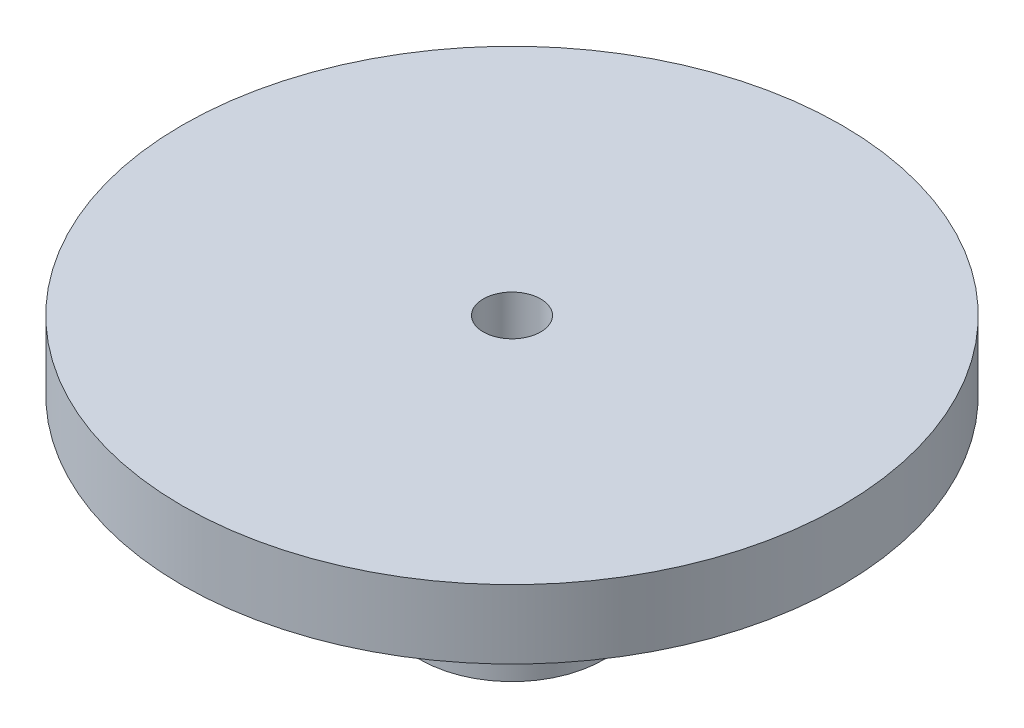
ISO-10303-21;
HEADER;
FILE_DESCRIPTION(('STEP AP214'),'2;1');
FILE_NAME('part.step','',(''),(''),'','','');
FILE_SCHEMA(('AUTOMOTIVE_DESIGN { 1 0 10303 214 1 1 1 1 }'));
ENDSEC;
DATA;
#1=APPLICATION_CONTEXT('core data for automotive mechanical design processes');
#2=APPLICATION_PROTOCOL_DEFINITION('international standard','automotive_design',2000,#1);
#3=PRODUCT_CONTEXT('',#1,'mechanical');
#4=PRODUCT('Part','Part','',(#3));
#5=PRODUCT_RELATED_PRODUCT_CATEGORY('part','',(#4));
#6=PRODUCT_DEFINITION_FORMATION('','',#4);
#7=PRODUCT_DEFINITION_CONTEXT('part definition',#1,'design');
#8=PRODUCT_DEFINITION('design','',#6,#7);
#9=PRODUCT_DEFINITION_SHAPE('','',#8);
#10=(LENGTH_UNIT() NAMED_UNIT(*) SI_UNIT(.MILLI.,.METRE.));
#11=(NAMED_UNIT(*) PLANE_ANGLE_UNIT() SI_UNIT($,.RADIAN.));
#12=(NAMED_UNIT(*) SI_UNIT($,.STERADIAN.) SOLID_ANGLE_UNIT());
#13=UNCERTAINTY_MEASURE_WITH_UNIT(LENGTH_MEASURE(1.E-05),#10,'distance_accuracy_value','');
#14=(GEOMETRIC_REPRESENTATION_CONTEXT(3) GLOBAL_UNCERTAINTY_ASSIGNED_CONTEXT((#13)) GLOBAL_UNIT_ASSIGNED_CONTEXT((#10,
#11,#12)) REPRESENTATION_CONTEXT('',''));
#15=CARTESIAN_POINT('',(0.,0.,0.));
#16=DIRECTION('',(0.,0.,1.));
#17=DIRECTION('',(1.,0.,0.));
#18=AXIS2_PLACEMENT_3D('',#15,#16,#17);
#19=CARTESIAN_POINT('',(0.,0.,0.));
#20=DIRECTION('',(0.,1.,0.));
#21=DIRECTION('',(0.,0.,1.));
#22=AXIS2_PLACEMENT_3D('',#19,#20,#21);
#23=PLANE('',#22);
#24=CARTESIAN_POINT('',(0.,0.,0.));
#25=DIRECTION('',(0.,1.,0.));
#26=DIRECTION('',(0.,0.,1.));
#27=AXIS2_PLACEMENT_3D('',#24,#25,#26);
#28=CIRCLE('',#27,8.);
#29=CARTESIAN_POINT('',(0.,0.,8.));
#30=VERTEX_POINT('',#29);
#31=EDGE_CURVE('E45',#30,#30,#28,.T.);
#32=ORIENTED_EDGE('',*,*,#31,.F.);
#33=EDGE_LOOP('',(#32));
#34=FACE_BOUND('',#33,.T.);
#35=CARTESIAN_POINT('',(0.,0.,0.));
#36=DIRECTION('',(0.,1.,0.));
#37=DIRECTION('',(0.,0.,1.));
#38=AXIS2_PLACEMENT_3D('',#35,#36,#37);
#39=CIRCLE('',#38,2.5);
#40=CARTESIAN_POINT('',(0.,0.,2.5));
#41=VERTEX_POINT('',#40);
#42=EDGE_CURVE('E54',#41,#41,#39,.T.);
#43=ORIENTED_EDGE('',*,*,#42,.T.);
#44=EDGE_LOOP('',(#43));
#45=FACE_BOUND('',#44,.T.);
#46=ADVANCED_FACE('F41',(#34,#45),#23,.F.);
#47=CARTESIAN_POINT('',(0.,16.,0.));
#48=DIRECTION('',(0.,-1.,0.));
#49=DIRECTION('',(0.,0.,-1.));
#50=AXIS2_PLACEMENT_3D('',#47,#48,#49);
#51=CYLINDRICAL_SURFACE('',#50,8.);
#52=CARTESIAN_POINT('',(0.,16.,0.));
#53=DIRECTION('',(0.,1.,0.));
#54=DIRECTION('',(0.,0.,1.));
#55=AXIS2_PLACEMENT_3D('',#52,#53,#54);
#56=CIRCLE('',#55,8.);
#57=CARTESIAN_POINT('',(0.,16.,8.));
#58=VERTEX_POINT('',#57);
#59=EDGE_CURVE('E10',#58,#58,#56,.T.);
#60=ORIENTED_EDGE('',*,*,#59,.F.);
#61=EDGE_LOOP('',(#60));
#62=FACE_BOUND('',#61,.T.);
#63=ORIENTED_EDGE('',*,*,#31,.T.);
#64=EDGE_LOOP('',(#63));
#65=FACE_BOUND('',#64,.T.);
#66=ADVANCED_FACE('F43',(#62,#65),#51,.T.);
#67=CARTESIAN_POINT('',(0.,16.,0.));
#68=DIRECTION('',(0.,-1.,0.));
#69=DIRECTION('',(0.,0.,-1.));
#70=AXIS2_PLACEMENT_3D('',#67,#68,#69);
#71=CYLINDRICAL_SURFACE('',#70,2.5);
#72=ORIENTED_EDGE('',*,*,#42,.F.);
#73=EDGE_LOOP('',(#72));
#74=FACE_BOUND('',#73,.T.);
#75=CARTESIAN_POINT('',(0.,22.,0.));
#76=DIRECTION('',(0.,1.,0.));
#77=DIRECTION('',(0.,0.,1.));
#78=AXIS2_PLACEMENT_3D('',#75,#76,#77);
#79=CIRCLE('',#78,2.5);
#80=CARTESIAN_POINT('',(0.,22.,2.5));
#81=VERTEX_POINT('',#80);
#82=EDGE_CURVE('E64',#81,#81,#79,.T.);
#83=ORIENTED_EDGE('',*,*,#82,.T.);
#84=EDGE_LOOP('',(#83));
#85=FACE_BOUND('',#84,.T.);
#86=ADVANCED_FACE('F72',(#74,#85),#71,.F.);
#87=CARTESIAN_POINT('',(0.,22.,0.));
#88=DIRECTION('',(0.,1.,0.));
#89=DIRECTION('',(0.,0.,1.));
#90=AXIS2_PLACEMENT_3D('',#87,#88,#89);
#91=PLANE('',#90);
#92=CARTESIAN_POINT('',(0.,22.,0.));
#93=DIRECTION('',(0.,1.,0.));
#94=DIRECTION('',(0.,0.,1.));
#95=AXIS2_PLACEMENT_3D('',#92,#93,#94);
#96=CIRCLE('',#95,28.75);
#97=CARTESIAN_POINT('',(0.,22.,28.75));
#98=VERTEX_POINT('',#97);
#99=EDGE_CURVE('E59',#98,#98,#96,.T.);
#100=ORIENTED_EDGE('',*,*,#99,.T.);
#101=EDGE_LOOP('',(#100));
#102=FACE_BOUND('',#101,.T.);
#103=ORIENTED_EDGE('',*,*,#82,.F.);
#104=EDGE_LOOP('',(#103));
#105=FACE_BOUND('',#104,.T.);
#106=ADVANCED_FACE('F74',(#102,#105),#91,.T.);
#107=CARTESIAN_POINT('',(0.,16.,0.));
#108=DIRECTION('',(0.,1.,0.));
#109=DIRECTION('',(0.,0.,1.));
#110=AXIS2_PLACEMENT_3D('',#107,#108,#109);
#111=PLANE('',#110);
#112=ORIENTED_EDGE('',*,*,#59,.T.);
#113=EDGE_LOOP('',(#112));
#114=FACE_BOUND('',#113,.T.);
#115=CARTESIAN_POINT('',(0.,16.,0.));
#116=DIRECTION('',(0.,1.,0.));
#117=DIRECTION('',(0.,0.,1.));
#118=AXIS2_PLACEMENT_3D('',#115,#116,#117);
#119=CIRCLE('',#118,28.75);
#120=CARTESIAN_POINT('',(0.,16.,28.75));
#121=VERTEX_POINT('',#120);
#122=EDGE_CURVE('E60',#121,#121,#119,.T.);
#123=ORIENTED_EDGE('',*,*,#122,.F.);
#124=EDGE_LOOP('',(#123));
#125=FACE_BOUND('',#124,.T.);
#126=ADVANCED_FACE('F76',(#114,#125),#111,.F.);
#127=CARTESIAN_POINT('',(0.,22.,0.));
#128=DIRECTION('',(0.,-1.,0.));
#129=DIRECTION('',(0.,0.,-1.));
#130=AXIS2_PLACEMENT_3D('',#127,#128,#129);
#131=CYLINDRICAL_SURFACE('',#130,28.75);
#132=ORIENTED_EDGE('',*,*,#99,.F.);
#133=EDGE_LOOP('',(#132));
#134=FACE_BOUND('',#133,.T.);
#135=ORIENTED_EDGE('',*,*,#122,.T.);
#136=EDGE_LOOP('',(#135));
#137=FACE_BOUND('',#136,.T.);
#138=ADVANCED_FACE('F83',(#134,#137),#131,.T.);
#139=CLOSED_SHELL('',(#46,#66,#86,#106,#126,#138));
#140=MANIFOLD_SOLID_BREP('B2',#139);
#141=ADVANCED_BREP_SHAPE_REPRESENTATION('',(#18,#140),#14);
#142=SHAPE_DEFINITION_REPRESENTATION(#9,#141);
ENDSEC;
END-ISO-10303-21;
